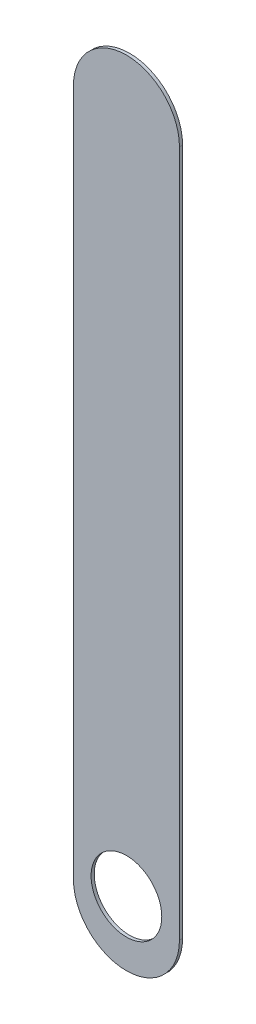
ISO-10303-21;
HEADER;
FILE_DESCRIPTION(('STEP AP214'),'2;1');
FILE_NAME('part.step','',(''),(''),'','','');
FILE_SCHEMA(('AUTOMOTIVE_DESIGN { 1 0 10303 214 1 1 1 1 }'));
ENDSEC;
DATA;
#1=APPLICATION_CONTEXT('core data for automotive mechanical design processes');
#2=APPLICATION_PROTOCOL_DEFINITION('international standard','automotive_design',2000,#1);
#3=PRODUCT_CONTEXT('',#1,'mechanical');
#4=PRODUCT('Part','Part','',(#3));
#5=PRODUCT_RELATED_PRODUCT_CATEGORY('part','',(#4));
#6=PRODUCT_DEFINITION_FORMATION('','',#4);
#7=PRODUCT_DEFINITION_CONTEXT('part definition',#1,'design');
#8=PRODUCT_DEFINITION('design','',#6,#7);
#9=PRODUCT_DEFINITION_SHAPE('','',#8);
#10=(LENGTH_UNIT() NAMED_UNIT(*) SI_UNIT(.MILLI.,.METRE.));
#11=(NAMED_UNIT(*) PLANE_ANGLE_UNIT() SI_UNIT($,.RADIAN.));
#12=(NAMED_UNIT(*) SI_UNIT($,.STERADIAN.) SOLID_ANGLE_UNIT());
#13=UNCERTAINTY_MEASURE_WITH_UNIT(LENGTH_MEASURE(1.E-05),#10,'distance_accuracy_value','');
#14=(GEOMETRIC_REPRESENTATION_CONTEXT(3) GLOBAL_UNCERTAINTY_ASSIGNED_CONTEXT((#13)) GLOBAL_UNIT_ASSIGNED_CONTEXT((#10,
#11,#12)) REPRESENTATION_CONTEXT('',''));
#15=CARTESIAN_POINT('',(0.,0.,0.));
#16=DIRECTION('',(0.,0.,1.));
#17=DIRECTION('',(1.,0.,0.));
#18=AXIS2_PLACEMENT_3D('',#15,#16,#17);
#19=CARTESIAN_POINT('',(86.3100128,106.67981458,0.));
#20=DIRECTION('',(-1.,0.,0.));
#21=DIRECTION('',(0.,1.,0.));
#22=AXIS2_PLACEMENT_3D('',#19,#20,#21);
#23=PLANE('',#22);
#24=DIRECTION('',(0.,1.,0.));
#25=VECTOR('',#24,1.);
#26=CARTESIAN_POINT('',(86.3100128,106.67981458,0.03556));
#27=LINE('',#26,#25);
#28=CARTESIAN_POINT('',(86.3100128,106.67981458,0.03556));
#29=VERTEX_POINT('',#28);
#30=CARTESIAN_POINT('',(86.3100128,114.4560068,0.03556));
#31=VERTEX_POINT('',#30);
#32=EDGE_CURVE('E11',#29,#31,#27,.T.);
#33=ORIENTED_EDGE('',*,*,#32,.F.);
#34=DIRECTION('',(0.,0.,1.));
#35=VECTOR('',#34,1.);
#36=CARTESIAN_POINT('',(86.3100128,106.67981458,0.));
#37=LINE('',#36,#35);
#38=CARTESIAN_POINT('',(86.3100128,106.67981458,0.));
#39=VERTEX_POINT('',#38);
#40=EDGE_CURVE('E24',#39,#29,#37,.T.);
#41=ORIENTED_EDGE('',*,*,#40,.F.);
#42=DIRECTION('',(0.,1.,0.));
#43=VECTOR('',#42,1.);
#44=CARTESIAN_POINT('',(86.3100128,106.67981458,0.));
#45=LINE('',#44,#43);
#46=CARTESIAN_POINT('',(86.3100128,114.4560068,0.));
#47=VERTEX_POINT('',#46);
#48=EDGE_CURVE('E96',#39,#47,#45,.T.);
#49=ORIENTED_EDGE('',*,*,#48,.T.);
#50=DIRECTION('',(0.,0.,1.));
#51=VECTOR('',#50,1.);
#52=CARTESIAN_POINT('',(86.3100128,114.4560068,0.));
#53=LINE('',#52,#51);
#54=EDGE_CURVE('E37',#47,#31,#53,.T.);
#55=ORIENTED_EDGE('',*,*,#54,.T.);
#56=EDGE_LOOP('',(#33,#41,#49,#55));
#57=FACE_BOUND('',#56,.T.);
#58=ADVANCED_FACE('F17',(#57),#23,.F.);
#59=CARTESIAN_POINT('',(85.710014,106.67981458,0.));
#60=DIRECTION('',(0.,0.,-1.));
#61=DIRECTION('',(-1.,0.,0.));
#62=AXIS2_PLACEMENT_3D('',#59,#60,#61);
#63=CYLINDRICAL_SURFACE('',#62,0.599998799999995);
#64=CARTESIAN_POINT('',(85.710014,106.67981458,0.03556));
#65=DIRECTION('',(0.,0.,1.));
#66=DIRECTION('',(-1.,0.,0.));
#67=AXIS2_PLACEMENT_3D('',#64,#65,#66);
#68=CIRCLE('',#67,0.599998799999995);
#69=CARTESIAN_POINT('',(85.1100152,106.67981458,0.03556));
#70=VERTEX_POINT('',#69);
#71=EDGE_CURVE('E92',#70,#29,#68,.T.);
#72=ORIENTED_EDGE('',*,*,#71,.F.);
#73=DIRECTION('',(0.,0.,1.));
#74=VECTOR('',#73,1.);
#75=CARTESIAN_POINT('',(85.1100152,106.67981458,0.));
#76=LINE('',#75,#74);
#77=CARTESIAN_POINT('',(85.1100152,106.67981458,0.));
#78=VERTEX_POINT('',#77);
#79=EDGE_CURVE('E90',#78,#70,#76,.T.);
#80=ORIENTED_EDGE('',*,*,#79,.F.);
#81=CARTESIAN_POINT('',(85.710014,106.67981458,0.));
#82=DIRECTION('',(0.,0.,1.));
#83=DIRECTION('',(-1.,0.,0.));
#84=AXIS2_PLACEMENT_3D('',#81,#82,#83);
#85=CIRCLE('',#84,0.599998799999995);
#86=EDGE_CURVE('E88',#78,#39,#85,.T.);
#87=ORIENTED_EDGE('',*,*,#86,.T.);
#88=ORIENTED_EDGE('',*,*,#40,.T.);
#89=EDGE_LOOP('',(#72,#80,#87,#88));
#90=FACE_BOUND('',#89,.T.);
#91=ADVANCED_FACE('F111',(#90),#63,.T.);
#92=CARTESIAN_POINT('',(85.710014,114.4560068,0.));
#93=DIRECTION('',(0.,0.,-1.));
#94=DIRECTION('',(1.,0.,0.));
#95=AXIS2_PLACEMENT_3D('',#92,#93,#94);
#96=CYLINDRICAL_SURFACE('',#95,0.59999879999999);
#97=CARTESIAN_POINT('',(85.710014,114.4560068,0.03556));
#98=DIRECTION('',(0.,0.,1.));
#99=DIRECTION('',(1.,0.,0.));
#100=AXIS2_PLACEMENT_3D('',#97,#98,#99);
#101=CIRCLE('',#100,0.59999879999999);
#102=CARTESIAN_POINT('',(85.1100152,114.4560068,0.03556));
#103=VERTEX_POINT('',#102);
#104=EDGE_CURVE('E85',#31,#103,#101,.T.);
#105=ORIENTED_EDGE('',*,*,#104,.F.);
#106=ORIENTED_EDGE('',*,*,#54,.F.);
#107=CARTESIAN_POINT('',(85.710014,114.4560068,0.));
#108=DIRECTION('',(0.,0.,1.));
#109=DIRECTION('',(1.,0.,0.));
#110=AXIS2_PLACEMENT_3D('',#107,#108,#109);
#111=CIRCLE('',#110,0.59999879999999);
#112=CARTESIAN_POINT('',(85.1100152,114.4560068,0.));
#113=VERTEX_POINT('',#112);
#114=EDGE_CURVE('E82',#47,#113,#111,.T.);
#115=ORIENTED_EDGE('',*,*,#114,.T.);
#116=DIRECTION('',(0.,0.,1.));
#117=VECTOR('',#116,1.);
#118=CARTESIAN_POINT('',(85.1100152,114.4560068,0.));
#119=LINE('',#118,#117);
#120=EDGE_CURVE('E80',#113,#103,#119,.T.);
#121=ORIENTED_EDGE('',*,*,#120,.T.);
#122=EDGE_LOOP('',(#105,#106,#115,#121));
#123=FACE_BOUND('',#122,.T.);
#124=ADVANCED_FACE('F104',(#123),#96,.T.);
#125=CARTESIAN_POINT('',(85.1100152,114.4560068,0.));
#126=DIRECTION('',(1.,0.,0.));
#127=DIRECTION('',(0.,-1.,0.));
#128=AXIS2_PLACEMENT_3D('',#125,#126,#127);
#129=PLANE('',#128);
#130=DIRECTION('',(0.,-1.,0.));
#131=VECTOR('',#130,1.);
#132=CARTESIAN_POINT('',(85.1100152,114.4560068,0.03556));
#133=LINE('',#132,#131);
#134=EDGE_CURVE('E77',#103,#70,#133,.T.);
#135=ORIENTED_EDGE('',*,*,#134,.F.);
#136=ORIENTED_EDGE('',*,*,#120,.F.);
#137=DIRECTION('',(0.,-1.,0.));
#138=VECTOR('',#137,1.);
#139=CARTESIAN_POINT('',(85.1100152,114.4560068,0.));
#140=LINE('',#139,#138);
#141=EDGE_CURVE('E68',#113,#78,#140,.T.);
#142=ORIENTED_EDGE('',*,*,#141,.T.);
#143=ORIENTED_EDGE('',*,*,#79,.T.);
#144=EDGE_LOOP('',(#135,#136,#142,#143));
#145=FACE_BOUND('',#144,.T.);
#146=ADVANCED_FACE('F110',(#145),#129,.F.);
#147=CARTESIAN_POINT('',(85.710014,106.8099972,0.));
#148=DIRECTION('',(0.,0.,-1.));
#149=DIRECTION('',(1.,0.,0.));
#150=AXIS2_PLACEMENT_3D('',#147,#148,#149);
#151=CYLINDRICAL_SURFACE('',#150,0.3999992);
#152=DIRECTION('',(0.,0.,1.));
#153=VECTOR('',#152,1.);
#154=CARTESIAN_POINT('',(86.1100132,106.8099972,0.));
#155=LINE('',#154,#153);
#156=CARTESIAN_POINT('',(86.1100132,106.8099972,0.));
#157=VERTEX_POINT('',#156);
#158=CARTESIAN_POINT('',(86.1100132,106.8099972,0.03556));
#159=VERTEX_POINT('',#158);
#160=EDGE_CURVE('E62',#157,#159,#155,.T.);
#161=ORIENTED_EDGE('',*,*,#160,.T.);
#162=CARTESIAN_POINT('',(85.710014,106.8099972,0.03556));
#163=DIRECTION('',(0.,0.,1.));
#164=DIRECTION('',(1.,0.,0.));
#165=AXIS2_PLACEMENT_3D('',#162,#163,#164);
#166=CIRCLE('',#165,0.3999992);
#167=EDGE_CURVE('E67',#159,#159,#166,.T.);
#168=ORIENTED_EDGE('',*,*,#167,.T.);
#169=ORIENTED_EDGE('',*,*,#160,.F.);
#170=CARTESIAN_POINT('',(85.710014,106.8099972,0.));
#171=DIRECTION('',(0.,0.,1.));
#172=DIRECTION('',(1.,0.,0.));
#173=AXIS2_PLACEMENT_3D('',#170,#171,#172);
#174=CIRCLE('',#173,0.3999992);
#175=EDGE_CURVE('E65',#157,#157,#174,.T.);
#176=ORIENTED_EDGE('',*,*,#175,.F.);
#177=EDGE_LOOP('',(#161,#168,#169,#176));
#178=FACE_BOUND('',#177,.T.);
#179=ADVANCED_FACE('F64',(#178),#151,.F.);
#180=CARTESIAN_POINT('',(86.3100128,106.67981458,0.));
#181=DIRECTION('',(0.,0.,-1.));
#182=DIRECTION('',(-1.,0.,0.));
#183=AXIS2_PLACEMENT_3D('',#180,#181,#182);
#184=PLANE('',#183);
#185=ORIENTED_EDGE('',*,*,#48,.F.);
#186=ORIENTED_EDGE('',*,*,#86,.F.);
#187=ORIENTED_EDGE('',*,*,#141,.F.);
#188=ORIENTED_EDGE('',*,*,#114,.F.);
#189=EDGE_LOOP('',(#185,#186,#187,#188));
#190=FACE_BOUND('',#189,.T.);
#191=ORIENTED_EDGE('',*,*,#175,.T.);
#192=EDGE_LOOP('',(#191));
#193=FACE_BOUND('',#192,.T.);
#194=ADVANCED_FACE('F71',(#190,#193),#184,.T.);
#195=CARTESIAN_POINT('',(86.3100128,106.67981458,0.03556));
#196=DIRECTION('',(0.,0.,-1.));
#197=DIRECTION('',(-1.,0.,0.));
#198=AXIS2_PLACEMENT_3D('',#195,#196,#197);
#199=PLANE('',#198);
#200=ORIENTED_EDGE('',*,*,#134,.T.);
#201=ORIENTED_EDGE('',*,*,#71,.T.);
#202=ORIENTED_EDGE('',*,*,#32,.T.);
#203=ORIENTED_EDGE('',*,*,#104,.T.);
#204=EDGE_LOOP('',(#200,#201,#202,#203));
#205=FACE_BOUND('',#204,.T.);
#206=ORIENTED_EDGE('',*,*,#167,.F.);
#207=EDGE_LOOP('',(#206));
#208=FACE_BOUND('',#207,.T.);
#209=ADVANCED_FACE('F107',(#205,#208),#199,.F.);
#210=CLOSED_SHELL('',(#58,#91,#124,#146,#179,#194,#209));
#211=MANIFOLD_SOLID_BREP('B1',#210);
#212=ADVANCED_BREP_SHAPE_REPRESENTATION('',(#18,#211),#14);
#213=SHAPE_DEFINITION_REPRESENTATION(#9,#212);
ENDSEC;
END-ISO-10303-21;
